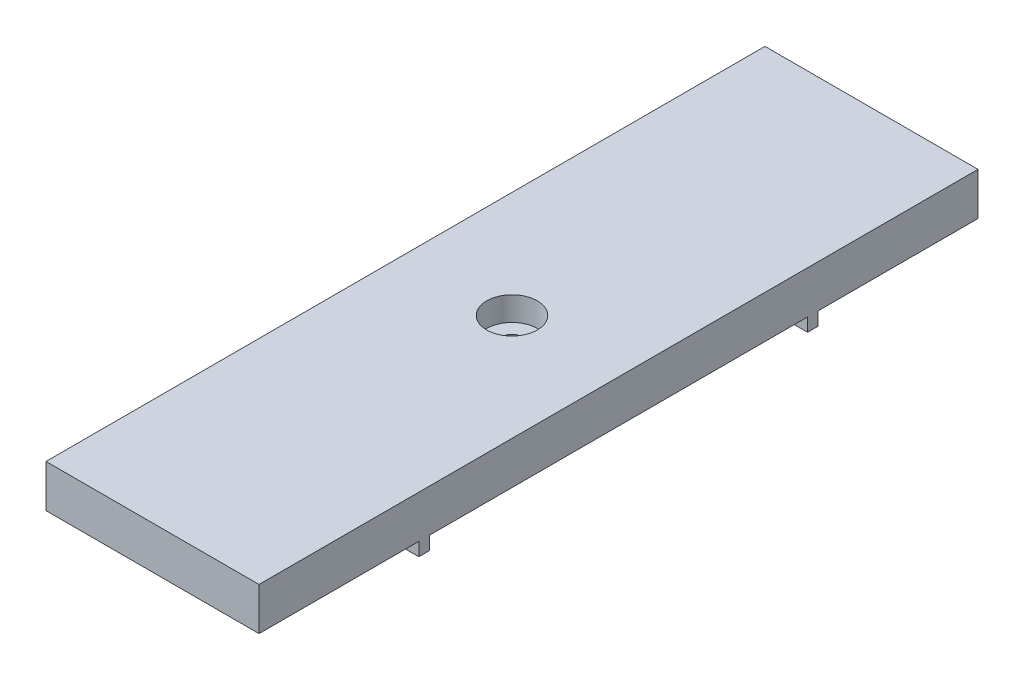
ISO-10303-21;
HEADER;
FILE_DESCRIPTION(('STEP AP214'),'2;1');
FILE_NAME('part.step','',(''),(''),'','','');
FILE_SCHEMA(('AUTOMOTIVE_DESIGN { 1 0 10303 214 1 1 1 1 }'));
ENDSEC;
DATA;
#1=APPLICATION_CONTEXT('core data for automotive mechanical design processes');
#2=APPLICATION_PROTOCOL_DEFINITION('international standard','automotive_design',2000,#1);
#3=PRODUCT_CONTEXT('',#1,'mechanical');
#4=PRODUCT('Part','Part','',(#3));
#5=PRODUCT_RELATED_PRODUCT_CATEGORY('part','',(#4));
#6=PRODUCT_DEFINITION_FORMATION('','',#4);
#7=PRODUCT_DEFINITION_CONTEXT('part definition',#1,'design');
#8=PRODUCT_DEFINITION('design','',#6,#7);
#9=PRODUCT_DEFINITION_SHAPE('','',#8);
#10=(LENGTH_UNIT() NAMED_UNIT(*) SI_UNIT(.MILLI.,.METRE.));
#11=(NAMED_UNIT(*) PLANE_ANGLE_UNIT() SI_UNIT($,.RADIAN.));
#12=(NAMED_UNIT(*) SI_UNIT($,.STERADIAN.) SOLID_ANGLE_UNIT());
#13=UNCERTAINTY_MEASURE_WITH_UNIT(LENGTH_MEASURE(1.E-05),#10,'distance_accuracy_value','');
#14=(GEOMETRIC_REPRESENTATION_CONTEXT(3) GLOBAL_UNCERTAINTY_ASSIGNED_CONTEXT((#13)) GLOBAL_UNIT_ASSIGNED_CONTEXT((#10,
#11,#12)) REPRESENTATION_CONTEXT('',''));
#15=CARTESIAN_POINT('',(0.,0.,0.));
#16=DIRECTION('',(0.,0.,1.));
#17=DIRECTION('',(1.,0.,0.));
#18=AXIS2_PLACEMENT_3D('',#15,#16,#17);
#19=CARTESIAN_POINT('',(0.,15.,0.));
#20=DIRECTION('',(0.,-1.,0.));
#21=DIRECTION('',(0.,0.,-1.));
#22=AXIS2_PLACEMENT_3D('',#19,#20,#21);
#23=PLANE('',#22);
#24=CARTESIAN_POINT('',(0.,15.,0.));
#25=DIRECTION('',(0.,1.,0.));
#26=DIRECTION('',(0.,0.,1.));
#27=AXIS2_PLACEMENT_3D('',#24,#25,#26);
#28=CIRCLE('',#27,3.85);
#29=CARTESIAN_POINT('',(0.,15.,3.85));
#30=VERTEX_POINT('',#29);
#31=EDGE_CURVE('E11',#30,#30,#28,.T.);
#32=ORIENTED_EDGE('',*,*,#31,.T.);
#33=EDGE_LOOP('',(#32));
#34=FACE_BOUND('',#33,.T.);
#35=DIRECTION('',(0.,0.,-1.));
#36=VECTOR('',#35,1.);
#37=CARTESIAN_POINT('',(20.,15.,67.5));
#38=LINE('',#37,#36);
#39=CARTESIAN_POINT('',(20.,15.,35.5));
#40=VERTEX_POINT('',#39);
#41=CARTESIAN_POINT('',(20.,15.,-35.5));
#42=VERTEX_POINT('',#41);
#43=EDGE_CURVE('E68',#40,#42,#38,.T.);
#44=ORIENTED_EDGE('',*,*,#43,.F.);
#45=DIRECTION('',(1.,0.,0.));
#46=VECTOR('',#45,1.);
#47=CARTESIAN_POINT('',(-20.,15.,35.5));
#48=LINE('',#47,#46);
#49=CARTESIAN_POINT('',(-20.,15.,35.5));
#50=VERTEX_POINT('',#49);
#51=EDGE_CURVE('E61',#50,#40,#48,.T.);
#52=ORIENTED_EDGE('',*,*,#51,.F.);
#53=DIRECTION('',(0.,0.,1.));
#54=VECTOR('',#53,1.);
#55=CARTESIAN_POINT('',(-20.,15.,67.5));
#56=LINE('',#55,#54);
#57=CARTESIAN_POINT('',(-20.,15.,-35.5));
#58=VERTEX_POINT('',#57);
#59=EDGE_CURVE('E150',#58,#50,#56,.T.);
#60=ORIENTED_EDGE('',*,*,#59,.F.);
#61=DIRECTION('',(-1.,0.,0.));
#62=VECTOR('',#61,1.);
#63=CARTESIAN_POINT('',(-20.,15.,-35.5));
#64=LINE('',#63,#62);
#65=EDGE_CURVE('E290',#42,#58,#64,.T.);
#66=ORIENTED_EDGE('',*,*,#65,.F.);
#67=EDGE_LOOP('',(#44,#52,#60,#66));
#68=FACE_BOUND('',#67,.T.);
#69=ADVANCED_FACE('F45',(#34,#68),#23,.T.);
#70=CARTESIAN_POINT('',(-20.,15.,37.5));
#71=VERTEX_POINT('',#70);
#72=CARTESIAN_POINT('',(-20.,15.,67.5));
#73=VERTEX_POINT('',#72);
#74=EDGE_CURVE('E163',#71,#73,#56,.T.);
#75=ORIENTED_EDGE('',*,*,#74,.F.);
#76=DIRECTION('',(-1.,0.,0.));
#77=VECTOR('',#76,1.);
#78=CARTESIAN_POINT('',(-20.,15.,37.5));
#79=LINE('',#78,#77);
#80=CARTESIAN_POINT('',(20.,15.,37.5));
#81=VERTEX_POINT('',#80);
#82=EDGE_CURVE('E153',#81,#71,#79,.T.);
#83=ORIENTED_EDGE('',*,*,#82,.F.);
#84=CARTESIAN_POINT('',(20.,15.,67.5));
#85=VERTEX_POINT('',#84);
#86=EDGE_CURVE('E176',#85,#81,#38,.T.);
#87=ORIENTED_EDGE('',*,*,#86,.F.);
#88=DIRECTION('',(1.,0.,0.));
#89=VECTOR('',#88,1.);
#90=CARTESIAN_POINT('',(-20.,15.,67.5));
#91=LINE('',#90,#89);
#92=EDGE_CURVE('E167',#73,#85,#91,.T.);
#93=ORIENTED_EDGE('',*,*,#92,.F.);
#94=EDGE_LOOP('',(#75,#83,#87,#93));
#95=FACE_BOUND('',#94,.T.);
#96=ADVANCED_FACE('F218',(#95),#23,.T.);
#97=CARTESIAN_POINT('',(20.,15.,-37.5));
#98=VERTEX_POINT('',#97);
#99=CARTESIAN_POINT('',(20.,15.,-67.5));
#100=VERTEX_POINT('',#99);
#101=EDGE_CURVE('E175',#98,#100,#38,.T.);
#102=ORIENTED_EDGE('',*,*,#101,.F.);
#103=DIRECTION('',(1.,0.,0.));
#104=VECTOR('',#103,1.);
#105=CARTESIAN_POINT('',(-20.,15.,-37.5));
#106=LINE('',#105,#104);
#107=CARTESIAN_POINT('',(-20.,15.,-37.5));
#108=VERTEX_POINT('',#107);
#109=EDGE_CURVE('E152',#108,#98,#106,.T.);
#110=ORIENTED_EDGE('',*,*,#109,.F.);
#111=CARTESIAN_POINT('',(-20.,15.,-67.5));
#112=VERTEX_POINT('',#111);
#113=EDGE_CURVE('E162',#112,#108,#56,.T.);
#114=ORIENTED_EDGE('',*,*,#113,.F.);
#115=DIRECTION('',(-1.,0.,0.));
#116=VECTOR('',#115,1.);
#117=CARTESIAN_POINT('',(-20.,15.,-67.5));
#118=LINE('',#117,#116);
#119=EDGE_CURVE('E180',#100,#112,#118,.T.);
#120=ORIENTED_EDGE('',*,*,#119,.F.);
#121=EDGE_LOOP('',(#102,#110,#114,#120));
#122=FACE_BOUND('',#121,.T.);
#123=ADVANCED_FACE('F215',(#122),#23,.T.);
#124=CARTESIAN_POINT('',(0.,15.,0.));
#125=DIRECTION('',(0.,-1.,0.));
#126=DIRECTION('',(0.,0.,-1.));
#127=AXIS2_PLACEMENT_3D('',#124,#125,#126);
#128=CYLINDRICAL_SURFACE('',#127,3.85);
#129=ORIENTED_EDGE('',*,*,#31,.F.);
#130=EDGE_LOOP('',(#129));
#131=FACE_BOUND('',#130,.T.);
#132=CARTESIAN_POINT('',(0.,0.,0.));
#133=DIRECTION('',(0.,1.,0.));
#134=DIRECTION('',(0.,0.,1.));
#135=AXIS2_PLACEMENT_3D('',#132,#133,#134);
#136=CIRCLE('',#135,3.85);
#137=CARTESIAN_POINT('',(0.,0.,3.85));
#138=VERTEX_POINT('',#137);
#139=EDGE_CURVE('E49',#138,#138,#136,.T.);
#140=ORIENTED_EDGE('',*,*,#139,.T.);
#141=EDGE_LOOP('',(#140));
#142=FACE_BOUND('',#141,.T.);
#143=ADVANCED_FACE('F47',(#131,#142),#128,.T.);
#144=CARTESIAN_POINT('',(0.,0.,0.));
#145=DIRECTION('',(0.,1.,0.));
#146=DIRECTION('',(0.,0.,1.));
#147=AXIS2_PLACEMENT_3D('',#144,#145,#146);
#148=PLANE('',#147);
#149=ORIENTED_EDGE('',*,*,#139,.F.);
#150=EDGE_LOOP('',(#149));
#151=FACE_BOUND('',#150,.T.);
#152=ADVANCED_FACE('F206',(#151),#148,.F.);
#153=CARTESIAN_POINT('',(-20.,23.,67.5));
#154=DIRECTION('',(1.,0.,0.));
#155=DIRECTION('',(0.,0.,-1.));
#156=AXIS2_PLACEMENT_3D('',#153,#154,#155);
#157=PLANE('',#156);
#158=ORIENTED_EDGE('',*,*,#113,.T.);
#159=DIRECTION('',(0.,1.,0.));
#160=VECTOR('',#159,1.);
#161=CARTESIAN_POINT('',(-20.,12.5,-37.5));
#162=LINE('',#161,#160);
#163=CARTESIAN_POINT('',(-20.,12.5,-37.5));
#164=VERTEX_POINT('',#163);
#165=EDGE_CURVE('E168',#164,#108,#162,.T.);
#166=ORIENTED_EDGE('',*,*,#165,.F.);
#167=DIRECTION('',(0.,0.,-1.));
#168=VECTOR('',#167,1.);
#169=CARTESIAN_POINT('',(-20.,12.5,-35.5));
#170=LINE('',#169,#168);
#171=CARTESIAN_POINT('',(-20.,12.5,-35.5));
#172=VERTEX_POINT('',#171);
#173=EDGE_CURVE('E285',#172,#164,#170,.T.);
#174=ORIENTED_EDGE('',*,*,#173,.F.);
#175=DIRECTION('',(0.,1.,0.));
#176=VECTOR('',#175,1.);
#177=CARTESIAN_POINT('',(-20.,12.5,-35.5));
#178=LINE('',#177,#176);
#179=EDGE_CURVE('E160',#172,#58,#178,.T.);
#180=ORIENTED_EDGE('',*,*,#179,.T.);
#181=ORIENTED_EDGE('',*,*,#59,.T.);
#182=DIRECTION('',(0.,1.,0.));
#183=VECTOR('',#182,1.);
#184=CARTESIAN_POINT('',(-20.,12.5,35.5));
#185=LINE('',#184,#183);
#186=CARTESIAN_POINT('',(-20.,12.5,35.5));
#187=VERTEX_POINT('',#186);
#188=EDGE_CURVE('E136',#187,#50,#185,.T.);
#189=ORIENTED_EDGE('',*,*,#188,.F.);
#190=DIRECTION('',(0.,0.,-1.));
#191=VECTOR('',#190,1.);
#192=CARTESIAN_POINT('',(-20.,12.5,35.5));
#193=LINE('',#192,#191);
#194=CARTESIAN_POINT('',(-20.,12.5,37.5));
#195=VERTEX_POINT('',#194);
#196=EDGE_CURVE('E144',#195,#187,#193,.T.);
#197=ORIENTED_EDGE('',*,*,#196,.F.);
#198=DIRECTION('',(0.,1.,0.));
#199=VECTOR('',#198,1.);
#200=CARTESIAN_POINT('',(-20.,12.5,37.5));
#201=LINE('',#200,#199);
#202=EDGE_CURVE('E145',#195,#71,#201,.T.);
#203=ORIENTED_EDGE('',*,*,#202,.T.);
#204=ORIENTED_EDGE('',*,*,#74,.T.);
#205=DIRECTION('',(0.,-1.,0.));
#206=VECTOR('',#205,1.);
#207=CARTESIAN_POINT('',(-20.,23.,67.5));
#208=LINE('',#207,#206);
#209=CARTESIAN_POINT('',(-20.,23.,67.5));
#210=VERTEX_POINT('',#209);
#211=EDGE_CURVE('E196',#210,#73,#208,.T.);
#212=ORIENTED_EDGE('',*,*,#211,.F.);
#213=DIRECTION('',(0.,0.,1.));
#214=VECTOR('',#213,1.);
#215=CARTESIAN_POINT('',(-20.,23.,67.5));
#216=LINE('',#215,#214);
#217=CARTESIAN_POINT('',(-20.,23.,-67.5));
#218=VERTEX_POINT('',#217);
#219=EDGE_CURVE('E183',#218,#210,#216,.T.);
#220=ORIENTED_EDGE('',*,*,#219,.F.);
#221=DIRECTION('',(0.,-1.,0.));
#222=VECTOR('',#221,1.);
#223=CARTESIAN_POINT('',(-20.,23.,-67.5));
#224=LINE('',#223,#222);
#225=EDGE_CURVE('E184',#218,#112,#224,.T.);
#226=ORIENTED_EDGE('',*,*,#225,.T.);
#227=EDGE_LOOP('',(#158,#166,#174,#180,#181,#189,#197,#203,#204,#212,#220,#226));
#228=FACE_BOUND('',#227,.T.);
#229=ADVANCED_FACE('F157',(#228),#157,.F.);
#230=CARTESIAN_POINT('',(-20.,23.,67.5));
#231=DIRECTION('',(0.,0.,-1.));
#232=DIRECTION('',(-1.,0.,0.));
#233=AXIS2_PLACEMENT_3D('',#230,#231,#232);
#234=PLANE('',#233);
#235=ORIENTED_EDGE('',*,*,#92,.T.);
#236=DIRECTION('',(0.,-1.,0.));
#237=VECTOR('',#236,1.);
#238=CARTESIAN_POINT('',(20.,23.,67.5));
#239=LINE('',#238,#237);
#240=CARTESIAN_POINT('',(20.,23.,67.5));
#241=VERTEX_POINT('',#240);
#242=EDGE_CURVE('E192',#241,#85,#239,.T.);
#243=ORIENTED_EDGE('',*,*,#242,.F.);
#244=DIRECTION('',(1.,0.,0.));
#245=VECTOR('',#244,1.);
#246=CARTESIAN_POINT('',(-20.,23.,67.5));
#247=LINE('',#246,#245);
#248=EDGE_CURVE('E243',#210,#241,#247,.T.);
#249=ORIENTED_EDGE('',*,*,#248,.F.);
#250=ORIENTED_EDGE('',*,*,#211,.T.);
#251=EDGE_LOOP('',(#235,#243,#249,#250));
#252=FACE_BOUND('',#251,.T.);
#253=ADVANCED_FACE('F213',(#252),#234,.F.);
#254=CARTESIAN_POINT('',(20.,23.,67.5));
#255=DIRECTION('',(-1.,0.,0.));
#256=DIRECTION('',(0.,0.,1.));
#257=AXIS2_PLACEMENT_3D('',#254,#255,#256);
#258=PLANE('',#257);
#259=ORIENTED_EDGE('',*,*,#86,.T.);
#260=DIRECTION('',(0.,1.,0.));
#261=VECTOR('',#260,1.);
#262=CARTESIAN_POINT('',(20.,12.5,37.5));
#263=LINE('',#262,#261);
#264=CARTESIAN_POINT('',(20.,12.5,37.5));
#265=VERTEX_POINT('',#264);
#266=EDGE_CURVE('E266',#265,#81,#263,.T.);
#267=ORIENTED_EDGE('',*,*,#266,.F.);
#268=DIRECTION('',(0.,0.,1.));
#269=VECTOR('',#268,1.);
#270=CARTESIAN_POINT('',(20.,12.5,35.5));
#271=LINE('',#270,#269);
#272=CARTESIAN_POINT('',(20.,12.5,35.5));
#273=VERTEX_POINT('',#272);
#274=EDGE_CURVE('E268',#273,#265,#271,.T.);
#275=ORIENTED_EDGE('',*,*,#274,.F.);
#276=DIRECTION('',(0.,1.,0.));
#277=VECTOR('',#276,1.);
#278=CARTESIAN_POINT('',(20.,12.5,35.5));
#279=LINE('',#278,#277);
#280=EDGE_CURVE('E271',#273,#40,#279,.T.);
#281=ORIENTED_EDGE('',*,*,#280,.T.);
#282=ORIENTED_EDGE('',*,*,#43,.T.);
#283=DIRECTION('',(0.,1.,0.));
#284=VECTOR('',#283,1.);
#285=CARTESIAN_POINT('',(20.,12.5,-35.5));
#286=LINE('',#285,#284);
#287=CARTESIAN_POINT('',(20.,12.5,-35.5));
#288=VERTEX_POINT('',#287);
#289=EDGE_CURVE('E305',#288,#42,#286,.T.);
#290=ORIENTED_EDGE('',*,*,#289,.F.);
#291=DIRECTION('',(0.,0.,1.));
#292=VECTOR('',#291,1.);
#293=CARTESIAN_POINT('',(20.,12.5,-35.5));
#294=LINE('',#293,#292);
#295=CARTESIAN_POINT('',(20.,12.5,-37.5));
#296=VERTEX_POINT('',#295);
#297=EDGE_CURVE('E293',#296,#288,#294,.T.);
#298=ORIENTED_EDGE('',*,*,#297,.F.);
#299=DIRECTION('',(0.,1.,0.));
#300=VECTOR('',#299,1.);
#301=CARTESIAN_POINT('',(20.,12.5,-37.5));
#302=LINE('',#301,#300);
#303=EDGE_CURVE('E308',#296,#98,#302,.T.);
#304=ORIENTED_EDGE('',*,*,#303,.T.);
#305=ORIENTED_EDGE('',*,*,#101,.T.);
#306=DIRECTION('',(0.,-1.,0.));
#307=VECTOR('',#306,1.);
#308=CARTESIAN_POINT('',(20.,23.,-67.5));
#309=LINE('',#308,#307);
#310=CARTESIAN_POINT('',(20.,23.,-67.5));
#311=VERTEX_POINT('',#310);
#312=EDGE_CURVE('E188',#311,#100,#309,.T.);
#313=ORIENTED_EDGE('',*,*,#312,.F.);
#314=DIRECTION('',(0.,0.,-1.));
#315=VECTOR('',#314,1.);
#316=CARTESIAN_POINT('',(20.,23.,67.5));
#317=LINE('',#316,#315);
#318=EDGE_CURVE('E246',#241,#311,#317,.T.);
#319=ORIENTED_EDGE('',*,*,#318,.F.);
#320=ORIENTED_EDGE('',*,*,#242,.T.);
#321=EDGE_LOOP('',(#259,#267,#275,#281,#282,#290,#298,#304,#305,#313,#319,#320));
#322=FACE_BOUND('',#321,.T.);
#323=ADVANCED_FACE('F264',(#322),#258,.F.);
#324=CARTESIAN_POINT('',(-20.,23.,-67.5));
#325=DIRECTION('',(0.,0.,1.));
#326=DIRECTION('',(1.,0.,0.));
#327=AXIS2_PLACEMENT_3D('',#324,#325,#326);
#328=PLANE('',#327);
#329=ORIENTED_EDGE('',*,*,#119,.T.);
#330=ORIENTED_EDGE('',*,*,#225,.F.);
#331=DIRECTION('',(-1.,0.,0.));
#332=VECTOR('',#331,1.);
#333=CARTESIAN_POINT('',(-20.,23.,-67.5));
#334=LINE('',#333,#332);
#335=EDGE_CURVE('E171',#311,#218,#334,.T.);
#336=ORIENTED_EDGE('',*,*,#335,.F.);
#337=ORIENTED_EDGE('',*,*,#312,.T.);
#338=EDGE_LOOP('',(#329,#330,#336,#337));
#339=FACE_BOUND('',#338,.T.);
#340=ADVANCED_FACE('F256',(#339),#328,.F.);
#341=CARTESIAN_POINT('',(0.,23.,0.));
#342=DIRECTION('',(0.,-1.,0.));
#343=DIRECTION('',(0.,0.,-1.));
#344=AXIS2_PLACEMENT_3D('',#341,#342,#343);
#345=PLANE('',#344);
#346=CARTESIAN_POINT('',(0.,23.,0.));
#347=DIRECTION('',(0.,1.,0.));
#348=DIRECTION('',(0.,0.,1.));
#349=AXIS2_PLACEMENT_3D('',#346,#347,#348);
#350=CIRCLE('',#349,4.75);
#351=CARTESIAN_POINT('',(0.,23.,4.75));
#352=VERTEX_POINT('',#351);
#353=EDGE_CURVE('E339',#352,#352,#350,.T.);
#354=ORIENTED_EDGE('',*,*,#353,.F.);
#355=EDGE_LOOP('',(#354));
#356=FACE_BOUND('',#355,.T.);
#357=ORIENTED_EDGE('',*,*,#219,.T.);
#358=ORIENTED_EDGE('',*,*,#248,.T.);
#359=ORIENTED_EDGE('',*,*,#318,.T.);
#360=ORIENTED_EDGE('',*,*,#335,.T.);
#361=EDGE_LOOP('',(#357,#358,#359,#360));
#362=FACE_BOUND('',#361,.T.);
#363=ADVANCED_FACE('F252',(#356,#362),#345,.F.);
#364=CARTESIAN_POINT('',(-20.,12.5,-37.5));
#365=DIRECTION('',(0.,0.,1.));
#366=DIRECTION('',(1.,0.,0.));
#367=AXIS2_PLACEMENT_3D('',#364,#365,#366);
#368=PLANE('',#367);
#369=ORIENTED_EDGE('',*,*,#109,.T.);
#370=ORIENTED_EDGE('',*,*,#303,.F.);
#371=DIRECTION('',(1.,0.,0.));
#372=VECTOR('',#371,1.);
#373=CARTESIAN_POINT('',(-20.,12.5,-37.5));
#374=LINE('',#373,#372);
#375=EDGE_CURVE('E289',#164,#296,#374,.T.);
#376=ORIENTED_EDGE('',*,*,#375,.F.);
#377=ORIENTED_EDGE('',*,*,#165,.T.);
#378=EDGE_LOOP('',(#369,#370,#376,#377));
#379=FACE_BOUND('',#378,.T.);
#380=ADVANCED_FACE('F314',(#379),#368,.F.);
#381=CARTESIAN_POINT('',(-20.,12.5,-35.5));
#382=DIRECTION('',(0.,0.,-1.));
#383=DIRECTION('',(-1.,0.,0.));
#384=AXIS2_PLACEMENT_3D('',#381,#382,#383);
#385=PLANE('',#384);
#386=ORIENTED_EDGE('',*,*,#65,.T.);
#387=ORIENTED_EDGE('',*,*,#179,.F.);
#388=DIRECTION('',(-1.,0.,0.));
#389=VECTOR('',#388,1.);
#390=CARTESIAN_POINT('',(-20.,12.5,-35.5));
#391=LINE('',#390,#389);
#392=EDGE_CURVE('E296',#288,#172,#391,.T.);
#393=ORIENTED_EDGE('',*,*,#392,.F.);
#394=ORIENTED_EDGE('',*,*,#289,.T.);
#395=EDGE_LOOP('',(#386,#387,#393,#394));
#396=FACE_BOUND('',#395,.T.);
#397=ADVANCED_FACE('F321',(#396),#385,.F.);
#398=CARTESIAN_POINT('',(0.,12.5,0.));
#399=DIRECTION('',(0.,-1.,0.));
#400=DIRECTION('',(0.,0.,-1.));
#401=AXIS2_PLACEMENT_3D('',#398,#399,#400);
#402=PLANE('',#401);
#403=ORIENTED_EDGE('',*,*,#173,.T.);
#404=ORIENTED_EDGE('',*,*,#375,.T.);
#405=ORIENTED_EDGE('',*,*,#297,.T.);
#406=ORIENTED_EDGE('',*,*,#392,.T.);
#407=EDGE_LOOP('',(#403,#404,#405,#406));
#408=FACE_BOUND('',#407,.T.);
#409=ADVANCED_FACE('F317',(#408),#402,.T.);
#410=CARTESIAN_POINT('',(-20.,12.5,35.5));
#411=DIRECTION('',(0.,0.,1.));
#412=DIRECTION('',(1.,0.,0.));
#413=AXIS2_PLACEMENT_3D('',#410,#411,#412);
#414=PLANE('',#413);
#415=ORIENTED_EDGE('',*,*,#51,.T.);
#416=ORIENTED_EDGE('',*,*,#280,.F.);
#417=DIRECTION('',(1.,0.,0.));
#418=VECTOR('',#417,1.);
#419=CARTESIAN_POINT('',(-20.,12.5,35.5));
#420=LINE('',#419,#418);
#421=EDGE_CURVE('E139',#187,#273,#420,.T.);
#422=ORIENTED_EDGE('',*,*,#421,.F.);
#423=ORIENTED_EDGE('',*,*,#188,.T.);
#424=EDGE_LOOP('',(#415,#416,#422,#423));
#425=FACE_BOUND('',#424,.T.);
#426=ADVANCED_FACE('F137',(#425),#414,.F.);
#427=CARTESIAN_POINT('',(-20.,12.5,37.5));
#428=DIRECTION('',(0.,0.,-1.));
#429=DIRECTION('',(-1.,0.,0.));
#430=AXIS2_PLACEMENT_3D('',#427,#428,#429);
#431=PLANE('',#430);
#432=ORIENTED_EDGE('',*,*,#82,.T.);
#433=ORIENTED_EDGE('',*,*,#202,.F.);
#434=DIRECTION('',(-1.,0.,0.));
#435=VECTOR('',#434,1.);
#436=CARTESIAN_POINT('',(-20.,12.5,37.5));
#437=LINE('',#436,#435);
#438=EDGE_CURVE('E273',#265,#195,#437,.T.);
#439=ORIENTED_EDGE('',*,*,#438,.F.);
#440=ORIENTED_EDGE('',*,*,#266,.T.);
#441=EDGE_LOOP('',(#432,#433,#439,#440));
#442=FACE_BOUND('',#441,.T.);
#443=ADVANCED_FACE('F274',(#442),#431,.F.);
#444=CARTESIAN_POINT('',(0.,12.5,0.));
#445=DIRECTION('',(0.,-1.,0.));
#446=DIRECTION('',(0.,0.,-1.));
#447=AXIS2_PLACEMENT_3D('',#444,#445,#446);
#448=PLANE('',#447);
#449=ORIENTED_EDGE('',*,*,#421,.T.);
#450=ORIENTED_EDGE('',*,*,#274,.T.);
#451=ORIENTED_EDGE('',*,*,#438,.T.);
#452=ORIENTED_EDGE('',*,*,#196,.T.);
#453=EDGE_LOOP('',(#449,#450,#451,#452));
#454=FACE_BOUND('',#453,.T.);
#455=ADVANCED_FACE('F372',(#454),#448,.T.);
#456=CARTESIAN_POINT('',(0.,18.5,0.));
#457=DIRECTION('',(0.,1.,0.));
#458=DIRECTION('',(0.,0.,1.));
#459=AXIS2_PLACEMENT_3D('',#456,#457,#458);
#460=CYLINDRICAL_SURFACE('',#459,4.75);
#461=CARTESIAN_POINT('',(0.,18.5,0.));
#462=DIRECTION('',(0.,1.,0.));
#463=DIRECTION('',(0.,0.,1.));
#464=AXIS2_PLACEMENT_3D('',#461,#462,#463);
#465=CIRCLE('',#464,4.75);
#466=CARTESIAN_POINT('',(0.,18.5,4.75));
#467=VERTEX_POINT('',#466);
#468=EDGE_CURVE('E342',#467,#467,#465,.T.);
#469=ORIENTED_EDGE('',*,*,#468,.F.);
#470=EDGE_LOOP('',(#469));
#471=FACE_BOUND('',#470,.T.);
#472=ORIENTED_EDGE('',*,*,#353,.T.);
#473=EDGE_LOOP('',(#472));
#474=FACE_BOUND('',#473,.T.);
#475=ADVANCED_FACE('F368',(#471,#474),#460,.F.);
#476=CARTESIAN_POINT('',(0.,18.5,0.));
#477=DIRECTION('',(0.,1.,0.));
#478=DIRECTION('',(0.,0.,1.));
#479=AXIS2_PLACEMENT_3D('',#476,#477,#478);
#480=PLANE('',#479);
#481=CARTESIAN_POINT('',(0.,18.5,0.));
#482=DIRECTION('',(0.,1.,0.));
#483=DIRECTION('',(0.,0.,1.));
#484=AXIS2_PLACEMENT_3D('',#481,#482,#483);
#485=CIRCLE('',#484,2.);
#486=CARTESIAN_POINT('',(0.,18.5,2.));
#487=VERTEX_POINT('',#486);
#488=EDGE_CURVE('E350',#487,#487,#485,.T.);
#489=ORIENTED_EDGE('',*,*,#488,.F.);
#490=EDGE_LOOP('',(#489));
#491=FACE_BOUND('',#490,.T.);
#492=ORIENTED_EDGE('',*,*,#468,.T.);
#493=EDGE_LOOP('',(#492));
#494=FACE_BOUND('',#493,.T.);
#495=ADVANCED_FACE('F365',(#491,#494),#480,.T.);
#496=CARTESIAN_POINT('',(0.,7.5,0.));
#497=DIRECTION('',(0.,1.,0.));
#498=DIRECTION('',(0.,0.,1.));
#499=AXIS2_PLACEMENT_3D('',#496,#497,#498);
#500=CYLINDRICAL_SURFACE('',#499,2.);
#501=CARTESIAN_POINT('',(0.,7.5,0.));
#502=DIRECTION('',(0.,1.,0.));
#503=DIRECTION('',(0.,0.,1.));
#504=AXIS2_PLACEMENT_3D('',#501,#502,#503);
#505=CIRCLE('',#504,2.);
#506=CARTESIAN_POINT('',(0.,7.5,2.));
#507=VERTEX_POINT('',#506);
#508=EDGE_CURVE('E343',#507,#507,#505,.T.);
#509=ORIENTED_EDGE('',*,*,#508,.F.);
#510=EDGE_LOOP('',(#509));
#511=FACE_BOUND('',#510,.T.);
#512=ORIENTED_EDGE('',*,*,#488,.T.);
#513=EDGE_LOOP('',(#512));
#514=FACE_BOUND('',#513,.T.);
#515=ADVANCED_FACE('F363',(#511,#514),#500,.F.);
#516=CARTESIAN_POINT('',(0.,7.5,0.));
#517=DIRECTION('',(0.,1.,0.));
#518=DIRECTION('',(0.,0.,1.));
#519=AXIS2_PLACEMENT_3D('',#516,#517,#518);
#520=PLANE('',#519);
#521=ORIENTED_EDGE('',*,*,#508,.T.);
#522=EDGE_LOOP('',(#521));
#523=FACE_BOUND('',#522,.T.);
#524=ADVANCED_FACE('F410',(#523),#520,.T.);
#525=CLOSED_SHELL('',(#69,#96,#123,#143,#152,#229,#253,#323,#340,#363,#380,#397,#409,#426,#443,
#455,#475,#495,#515,#524));
#526=MANIFOLD_SOLID_BREP('B2',#525);
#527=ADVANCED_BREP_SHAPE_REPRESENTATION('',(#18,#526),#14);
#528=SHAPE_DEFINITION_REPRESENTATION(#9,#527);
ENDSEC;
END-ISO-10303-21;
